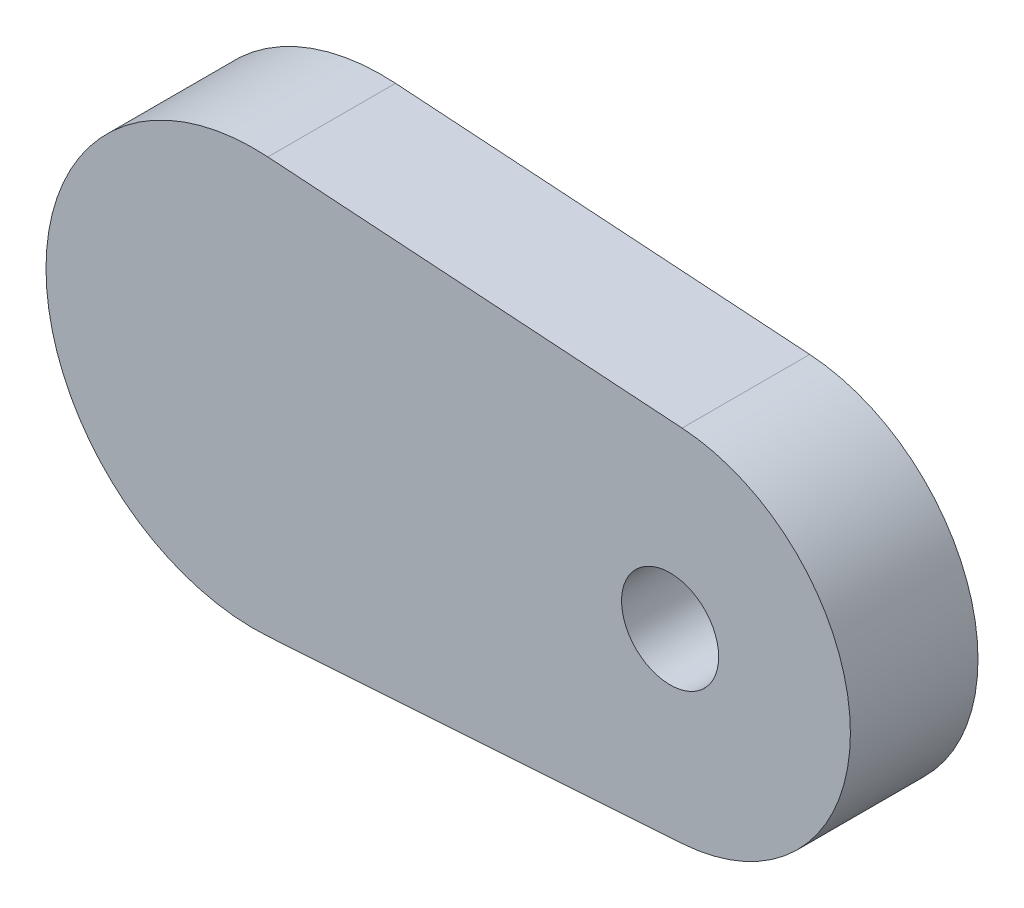
ISO-10303-21;
HEADER;
FILE_DESCRIPTION(('STEP AP214'),'2;1');
FILE_NAME('part.step','',(''),(''),'','','');
FILE_SCHEMA(('AUTOMOTIVE_DESIGN { 1 0 10303 214 1 1 1 1 }'));
ENDSEC;
DATA;
#1=APPLICATION_CONTEXT('core data for automotive mechanical design processes');
#2=APPLICATION_PROTOCOL_DEFINITION('international standard','automotive_design',2000,#1);
#3=PRODUCT_CONTEXT('',#1,'mechanical');
#4=PRODUCT('Part','Part','',(#3));
#5=PRODUCT_RELATED_PRODUCT_CATEGORY('part','',(#4));
#6=PRODUCT_DEFINITION_FORMATION('','',#4);
#7=PRODUCT_DEFINITION_CONTEXT('part definition',#1,'design');
#8=PRODUCT_DEFINITION('design','',#6,#7);
#9=PRODUCT_DEFINITION_SHAPE('','',#8);
#10=(LENGTH_UNIT() NAMED_UNIT(*) SI_UNIT(.MILLI.,.METRE.));
#11=(NAMED_UNIT(*) PLANE_ANGLE_UNIT() SI_UNIT($,.RADIAN.));
#12=(NAMED_UNIT(*) SI_UNIT($,.STERADIAN.) SOLID_ANGLE_UNIT());
#13=UNCERTAINTY_MEASURE_WITH_UNIT(LENGTH_MEASURE(1.E-05),#10,'distance_accuracy_value','');
#14=(GEOMETRIC_REPRESENTATION_CONTEXT(3) GLOBAL_UNCERTAINTY_ASSIGNED_CONTEXT((#13)) GLOBAL_UNIT_ASSIGNED_CONTEXT((#10,
#11,#12)) REPRESENTATION_CONTEXT('',''));
#15=CARTESIAN_POINT('',(0.,0.,0.));
#16=DIRECTION('',(0.,0.,1.));
#17=DIRECTION('',(1.,0.,0.));
#18=AXIS2_PLACEMENT_3D('',#15,#16,#17);
#19=CARTESIAN_POINT('',(17.5567410519957,17.5256772580504,4.6));
#20=DIRECTION('',(0.,0.,1.));
#21=DIRECTION('',(1.,0.,0.));
#22=AXIS2_PLACEMENT_3D('',#19,#20,#21);
#23=PLANE('',#22);
#24=CARTESIAN_POINT('',(17.5567410519957,17.5256772580504,4.6));
#25=DIRECTION('',(0.,0.,1.));
#26=DIRECTION('',(1.,0.,0.));
#27=AXIS2_PLACEMENT_3D('',#24,#25,#26);
#28=CIRCLE('',#27,7.50000000000016);
#29=CARTESIAN_POINT('',(18.0567410519957,25.0089920315984,4.6));
#30=VERTEX_POINT('',#29);
#31=CARTESIAN_POINT('',(18.0567410519957,10.0423624845023,4.6));
#32=VERTEX_POINT('',#31);
#33=EDGE_CURVE('E86',#30,#32,#28,.T.);
#34=ORIENTED_EDGE('',*,*,#33,.T.);
#35=DIRECTION('',(0.997775303139717,0.0666666666666759,0.));
#36=VECTOR('',#35,1.);
#37=CARTESIAN_POINT('',(18.0567410519957,10.0423624845023,4.6));
#38=LINE('',#37,#36);
#39=CARTESIAN_POINT('',(32.9900743853291,11.0401377876422,4.6));
#40=VERTEX_POINT('',#39);
#41=EDGE_CURVE('E81',#32,#40,#38,.T.);
#42=ORIENTED_EDGE('',*,*,#41,.T.);
#43=CARTESIAN_POINT('',(32.5567410519957,17.5256772580504,4.6));
#44=DIRECTION('',(0.,0.,1.));
#45=DIRECTION('',(1.,0.,0.));
#46=AXIS2_PLACEMENT_3D('',#43,#44,#45);
#47=CIRCLE('',#46,6.50000000000002);
#48=CARTESIAN_POINT('',(32.9900743853291,24.0112167284585,4.6));
#49=VERTEX_POINT('',#48);
#50=EDGE_CURVE('E84',#40,#49,#47,.T.);
#51=ORIENTED_EDGE('',*,*,#50,.T.);
#52=DIRECTION('',(-0.997775303139717,0.0666666666666761,0.));
#53=VECTOR('',#52,1.);
#54=CARTESIAN_POINT('',(32.9900743853291,24.0112167284585,4.6));
#55=LINE('',#54,#53);
#56=EDGE_CURVE('E51',#49,#30,#55,.T.);
#57=ORIENTED_EDGE('',*,*,#56,.T.);
#58=EDGE_LOOP('',(#34,#42,#51,#57));
#59=FACE_BOUND('',#58,.T.);
#60=CARTESIAN_POINT('',(32.5567410519957,17.5256772580504,4.6));
#61=DIRECTION('',(0.,0.,1.));
#62=DIRECTION('',(1.,0.,0.));
#63=AXIS2_PLACEMENT_3D('',#60,#61,#62);
#64=CIRCLE('',#63,1.75);
#65=CARTESIAN_POINT('',(34.3067410519957,17.5256772580504,4.6));
#66=VERTEX_POINT('',#65);
#67=EDGE_CURVE('E101',#66,#66,#64,.T.);
#68=ORIENTED_EDGE('',*,*,#67,.F.);
#69=EDGE_LOOP('',(#68));
#70=FACE_BOUND('',#69,.T.);
#71=ADVANCED_FACE('F34',(#59,#70),#23,.T.);
#72=CARTESIAN_POINT('',(17.5567410519957,17.5256772580504,0.));
#73=DIRECTION('',(0.,0.,1.));
#74=DIRECTION('',(1.,0.,0.));
#75=AXIS2_PLACEMENT_3D('',#72,#73,#74);
#76=PLANE('',#75);
#77=CARTESIAN_POINT('',(17.5567410519957,17.5256772580504,0.));
#78=DIRECTION('',(0.,0.,1.));
#79=DIRECTION('',(1.,0.,0.));
#80=AXIS2_PLACEMENT_3D('',#77,#78,#79);
#81=CIRCLE('',#80,7.50000000000016);
#82=CARTESIAN_POINT('',(18.0567410519957,25.0089920315984,0.));
#83=VERTEX_POINT('',#82);
#84=CARTESIAN_POINT('',(18.0567410519957,10.0423624845023,0.));
#85=VERTEX_POINT('',#84);
#86=EDGE_CURVE('E98',#83,#85,#81,.T.);
#87=ORIENTED_EDGE('',*,*,#86,.F.);
#88=DIRECTION('',(-0.997775303139717,0.0666666666666761,0.));
#89=VECTOR('',#88,1.);
#90=CARTESIAN_POINT('',(32.9900743853291,24.0112167284585,0.));
#91=LINE('',#90,#89);
#92=CARTESIAN_POINT('',(32.9900743853291,24.0112167284585,0.));
#93=VERTEX_POINT('',#92);
#94=EDGE_CURVE('E74',#93,#83,#91,.T.);
#95=ORIENTED_EDGE('',*,*,#94,.F.);
#96=CARTESIAN_POINT('',(32.5567410519957,17.5256772580504,0.));
#97=DIRECTION('',(0.,0.,1.));
#98=DIRECTION('',(1.,0.,0.));
#99=AXIS2_PLACEMENT_3D('',#96,#97,#98);
#100=CIRCLE('',#99,6.50000000000002);
#101=CARTESIAN_POINT('',(32.9900743853291,11.0401377876422,0.));
#102=VERTEX_POINT('',#101);
#103=EDGE_CURVE('E68',#102,#93,#100,.T.);
#104=ORIENTED_EDGE('',*,*,#103,.F.);
#105=DIRECTION('',(0.997775303139717,0.0666666666666759,0.));
#106=VECTOR('',#105,1.);
#107=CARTESIAN_POINT('',(18.0567410519957,10.0423624845023,0.));
#108=LINE('',#107,#106);
#109=EDGE_CURVE('E90',#85,#102,#108,.T.);
#110=ORIENTED_EDGE('',*,*,#109,.F.);
#111=EDGE_LOOP('',(#87,#95,#104,#110));
#112=FACE_BOUND('',#111,.T.);
#113=CARTESIAN_POINT('',(32.5567410519957,17.5256772580504,0.));
#114=DIRECTION('',(0.,0.,1.));
#115=DIRECTION('',(1.,0.,0.));
#116=AXIS2_PLACEMENT_3D('',#113,#114,#115);
#117=CIRCLE('',#116,1.75);
#118=CARTESIAN_POINT('',(34.3067410519957,17.5256772580504,0.));
#119=VERTEX_POINT('',#118);
#120=EDGE_CURVE('E113',#119,#119,#117,.T.);
#121=ORIENTED_EDGE('',*,*,#120,.T.);
#122=EDGE_LOOP('',(#121));
#123=FACE_BOUND('',#122,.T.);
#124=ADVANCED_FACE('F109',(#112,#123),#76,.F.);
#125=CARTESIAN_POINT('',(17.5567410519957,17.5256772580504,4.6));
#126=DIRECTION('',(0.,0.,-1.));
#127=DIRECTION('',(-1.,0.,0.));
#128=AXIS2_PLACEMENT_3D('',#125,#126,#127);
#129=CYLINDRICAL_SURFACE('',#128,7.50000000000016);
#130=ORIENTED_EDGE('',*,*,#86,.T.);
#131=DIRECTION('',(0.,0.,-1.));
#132=VECTOR('',#131,1.);
#133=CARTESIAN_POINT('',(18.0567410519957,10.0423624845023,4.6));
#134=LINE('',#133,#132);
#135=EDGE_CURVE('E11',#32,#85,#134,.T.);
#136=ORIENTED_EDGE('',*,*,#135,.F.);
#137=ORIENTED_EDGE('',*,*,#33,.F.);
#138=DIRECTION('',(0.,0.,-1.));
#139=VECTOR('',#138,1.);
#140=CARTESIAN_POINT('',(18.0567410519957,25.0089920315984,4.6));
#141=LINE('',#140,#139);
#142=EDGE_CURVE('E94',#30,#83,#141,.T.);
#143=ORIENTED_EDGE('',*,*,#142,.T.);
#144=EDGE_LOOP('',(#130,#136,#137,#143));
#145=FACE_BOUND('',#144,.T.);
#146=ADVANCED_FACE('F36',(#145),#129,.T.);
#147=CARTESIAN_POINT('',(18.0567410519957,10.0423624845023,4.6));
#148=DIRECTION('',(-0.0666666666666759,0.997775303139717,0.));
#149=DIRECTION('',(-0.997775303139717,-0.0666666666666759,0.));
#150=AXIS2_PLACEMENT_3D('',#147,#148,#149);
#151=PLANE('',#150);
#152=ORIENTED_EDGE('',*,*,#109,.T.);
#153=DIRECTION('',(0.,0.,-1.));
#154=VECTOR('',#153,1.);
#155=CARTESIAN_POINT('',(32.9900743853291,11.0401377876422,4.6));
#156=LINE('',#155,#154);
#157=EDGE_CURVE('E43',#40,#102,#156,.T.);
#158=ORIENTED_EDGE('',*,*,#157,.F.);
#159=ORIENTED_EDGE('',*,*,#41,.F.);
#160=ORIENTED_EDGE('',*,*,#135,.T.);
#161=EDGE_LOOP('',(#152,#158,#159,#160));
#162=FACE_BOUND('',#161,.T.);
#163=ADVANCED_FACE('F89',(#162),#151,.F.);
#164=CARTESIAN_POINT('',(32.5567410519957,17.5256772580504,4.6));
#165=DIRECTION('',(0.,0.,-1.));
#166=DIRECTION('',(-1.,0.,0.));
#167=AXIS2_PLACEMENT_3D('',#164,#165,#166);
#168=CYLINDRICAL_SURFACE('',#167,6.50000000000002);
#169=ORIENTED_EDGE('',*,*,#103,.T.);
#170=DIRECTION('',(0.,0.,-1.));
#171=VECTOR('',#170,1.);
#172=CARTESIAN_POINT('',(32.9900743853291,24.0112167284585,4.6));
#173=LINE('',#172,#171);
#174=EDGE_CURVE('E91',#49,#93,#173,.T.);
#175=ORIENTED_EDGE('',*,*,#174,.F.);
#176=ORIENTED_EDGE('',*,*,#50,.F.);
#177=ORIENTED_EDGE('',*,*,#157,.T.);
#178=EDGE_LOOP('',(#169,#175,#176,#177));
#179=FACE_BOUND('',#178,.T.);
#180=ADVANCED_FACE('F92',(#179),#168,.T.);
#181=CARTESIAN_POINT('',(32.9900743853291,24.0112167284585,4.6));
#182=DIRECTION('',(-0.0666666666666761,-0.997775303139717,0.));
#183=DIRECTION('',(0.997775303139717,-0.0666666666666761,0.));
#184=AXIS2_PLACEMENT_3D('',#181,#182,#183);
#185=PLANE('',#184);
#186=ORIENTED_EDGE('',*,*,#94,.T.);
#187=ORIENTED_EDGE('',*,*,#142,.F.);
#188=ORIENTED_EDGE('',*,*,#56,.F.);
#189=ORIENTED_EDGE('',*,*,#174,.T.);
#190=EDGE_LOOP('',(#186,#187,#188,#189));
#191=FACE_BOUND('',#190,.T.);
#192=ADVANCED_FACE('F106',(#191),#185,.F.);
#193=CARTESIAN_POINT('',(32.5567410519957,17.5256772580504,4.6));
#194=DIRECTION('',(0.,0.,-1.));
#195=DIRECTION('',(-1.,0.,0.));
#196=AXIS2_PLACEMENT_3D('',#193,#194,#195);
#197=CYLINDRICAL_SURFACE('',#196,1.75);
#198=ORIENTED_EDGE('',*,*,#67,.T.);
#199=EDGE_LOOP('',(#198));
#200=FACE_BOUND('',#199,.T.);
#201=ORIENTED_EDGE('',*,*,#120,.F.);
#202=EDGE_LOOP('',(#201));
#203=FACE_BOUND('',#202,.T.);
#204=ADVANCED_FACE('F119',(#200,#203),#197,.F.);
#205=CLOSED_SHELL('',(#71,#124,#146,#163,#180,#192,#204));
#206=MANIFOLD_SOLID_BREP('B2',#205);
#207=ADVANCED_BREP_SHAPE_REPRESENTATION('',(#18,#206),#14);
#208=SHAPE_DEFINITION_REPRESENTATION(#9,#207);
ENDSEC;
END-ISO-10303-21;
